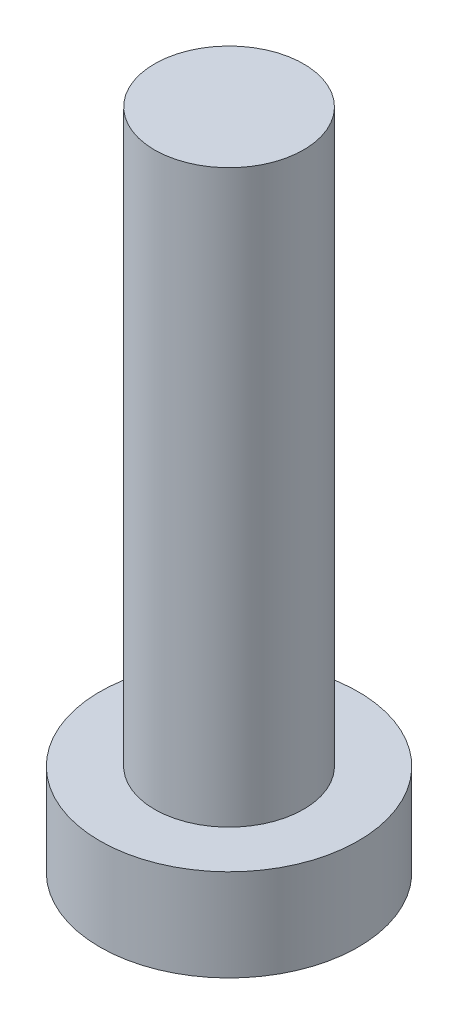
ISO-10303-21;
HEADER;
FILE_DESCRIPTION(('STEP AP214'),'2;1');
FILE_NAME('part.step','',(''),(''),'','','');
FILE_SCHEMA(('AUTOMOTIVE_DESIGN { 1 0 10303 214 1 1 1 1 }'));
ENDSEC;
DATA;
#1=APPLICATION_CONTEXT('core data for automotive mechanical design processes');
#2=APPLICATION_PROTOCOL_DEFINITION('international standard','automotive_design',2000,#1);
#3=PRODUCT_CONTEXT('',#1,'mechanical');
#4=PRODUCT('Part','Part','',(#3));
#5=PRODUCT_RELATED_PRODUCT_CATEGORY('part','',(#4));
#6=PRODUCT_DEFINITION_FORMATION('','',#4);
#7=PRODUCT_DEFINITION_CONTEXT('part definition',#1,'design');
#8=PRODUCT_DEFINITION('design','',#6,#7);
#9=PRODUCT_DEFINITION_SHAPE('','',#8);
#10=(LENGTH_UNIT() NAMED_UNIT(*) SI_UNIT(.MILLI.,.METRE.));
#11=(NAMED_UNIT(*) PLANE_ANGLE_UNIT() SI_UNIT($,.RADIAN.));
#12=(NAMED_UNIT(*) SI_UNIT($,.STERADIAN.) SOLID_ANGLE_UNIT());
#13=UNCERTAINTY_MEASURE_WITH_UNIT(LENGTH_MEASURE(1.E-05),#10,'distance_accuracy_value','');
#14=(GEOMETRIC_REPRESENTATION_CONTEXT(3) GLOBAL_UNCERTAINTY_ASSIGNED_CONTEXT((#13)) GLOBAL_UNIT_ASSIGNED_CONTEXT((#10,
#11,#12)) REPRESENTATION_CONTEXT('',''));
#15=CARTESIAN_POINT('',(0.,0.,0.));
#16=DIRECTION('',(0.,0.,1.));
#17=DIRECTION('',(1.,0.,0.));
#18=AXIS2_PLACEMENT_3D('',#15,#16,#17);
#19=CARTESIAN_POINT('',(0.,1.85,0.));
#20=DIRECTION('',(0.,-1.,0.));
#21=DIRECTION('',(0.,0.,-1.));
#22=AXIS2_PLACEMENT_3D('',#19,#20,#21);
#23=CYLINDRICAL_SURFACE('',#22,2.6);
#24=CARTESIAN_POINT('',(0.,1.85,0.));
#25=DIRECTION('',(0.,1.,0.));
#26=DIRECTION('',(0.,0.,1.));
#27=AXIS2_PLACEMENT_3D('',#24,#25,#26);
#28=CIRCLE('',#27,2.6);
#29=CARTESIAN_POINT('',(0.,1.85,2.6));
#30=VERTEX_POINT('',#29);
#31=EDGE_CURVE('E51',#30,#30,#28,.T.);
#32=ORIENTED_EDGE('',*,*,#31,.F.);
#33=EDGE_LOOP('',(#32));
#34=FACE_BOUND('',#33,.T.);
#35=CARTESIAN_POINT('',(0.,0.,0.));
#36=DIRECTION('',(0.,1.,0.));
#37=DIRECTION('',(0.,0.,1.));
#38=AXIS2_PLACEMENT_3D('',#35,#36,#37);
#39=CIRCLE('',#38,2.6);
#40=CARTESIAN_POINT('',(0.,0.,2.6));
#41=VERTEX_POINT('',#40);
#42=EDGE_CURVE('E46',#41,#41,#39,.T.);
#43=ORIENTED_EDGE('',*,*,#42,.T.);
#44=EDGE_LOOP('',(#43));
#45=FACE_BOUND('',#44,.T.);
#46=ADVANCED_FACE('F43',(#34,#45),#23,.T.);
#47=CARTESIAN_POINT('',(0.,1.85,0.));
#48=DIRECTION('',(0.,1.,0.));
#49=DIRECTION('',(0.,0.,1.));
#50=AXIS2_PLACEMENT_3D('',#47,#48,#49);
#51=PLANE('',#50);
#52=CARTESIAN_POINT('',(0.,1.85,0.));
#53=DIRECTION('',(0.,1.,0.));
#54=DIRECTION('',(0.,0.,1.));
#55=AXIS2_PLACEMENT_3D('',#52,#53,#54);
#56=CIRCLE('',#55,1.5);
#57=CARTESIAN_POINT('',(0.,1.85,1.5));
#58=VERTEX_POINT('',#57);
#59=EDGE_CURVE('E10',#58,#58,#56,.T.);
#60=ORIENTED_EDGE('',*,*,#59,.F.);
#61=EDGE_LOOP('',(#60));
#62=FACE_BOUND('',#61,.T.);
#63=ORIENTED_EDGE('',*,*,#31,.T.);
#64=EDGE_LOOP('',(#63));
#65=FACE_BOUND('',#64,.T.);
#66=ADVANCED_FACE('F71',(#62,#65),#51,.T.);
#67=CARTESIAN_POINT('',(0.,0.,0.));
#68=DIRECTION('',(0.,1.,0.));
#69=DIRECTION('',(0.,0.,1.));
#70=AXIS2_PLACEMENT_3D('',#67,#68,#69);
#71=PLANE('',#70);
#72=ORIENTED_EDGE('',*,*,#42,.F.);
#73=EDGE_LOOP('',(#72));
#74=FACE_BOUND('',#73,.T.);
#75=ADVANCED_FACE('F68',(#74),#71,.F.);
#76=CARTESIAN_POINT('',(0.,13.34,0.));
#77=DIRECTION('',(0.,-1.,0.));
#78=DIRECTION('',(0.,0.,-1.));
#79=AXIS2_PLACEMENT_3D('',#76,#77,#78);
#80=CYLINDRICAL_SURFACE('',#79,1.5);
#81=CARTESIAN_POINT('',(0.,13.34,0.));
#82=DIRECTION('',(0.,1.,0.));
#83=DIRECTION('',(0.,0.,1.));
#84=AXIS2_PLACEMENT_3D('',#81,#82,#83);
#85=CIRCLE('',#84,1.5);
#86=CARTESIAN_POINT('',(0.,13.34,1.5));
#87=VERTEX_POINT('',#86);
#88=EDGE_CURVE('E58',#87,#87,#85,.T.);
#89=ORIENTED_EDGE('',*,*,#88,.F.);
#90=EDGE_LOOP('',(#89));
#91=FACE_BOUND('',#90,.T.);
#92=ORIENTED_EDGE('',*,*,#59,.T.);
#93=EDGE_LOOP('',(#92));
#94=FACE_BOUND('',#93,.T.);
#95=ADVANCED_FACE('F70',(#91,#94),#80,.T.);
#96=CARTESIAN_POINT('',(0.,13.34,0.));
#97=DIRECTION('',(0.,1.,0.));
#98=DIRECTION('',(0.,0.,1.));
#99=AXIS2_PLACEMENT_3D('',#96,#97,#98);
#100=PLANE('',#99);
#101=ORIENTED_EDGE('',*,*,#88,.T.);
#102=EDGE_LOOP('',(#101));
#103=FACE_BOUND('',#102,.T.);
#104=ADVANCED_FACE('F77',(#103),#100,.T.);
#105=CLOSED_SHELL('',(#46,#66,#75,#95,#104));
#106=MANIFOLD_SOLID_BREP('B2',#105);
#107=ADVANCED_BREP_SHAPE_REPRESENTATION('',(#18,#106),#14);
#108=SHAPE_DEFINITION_REPRESENTATION(#9,#107);
ENDSEC;
END-ISO-10303-21;
